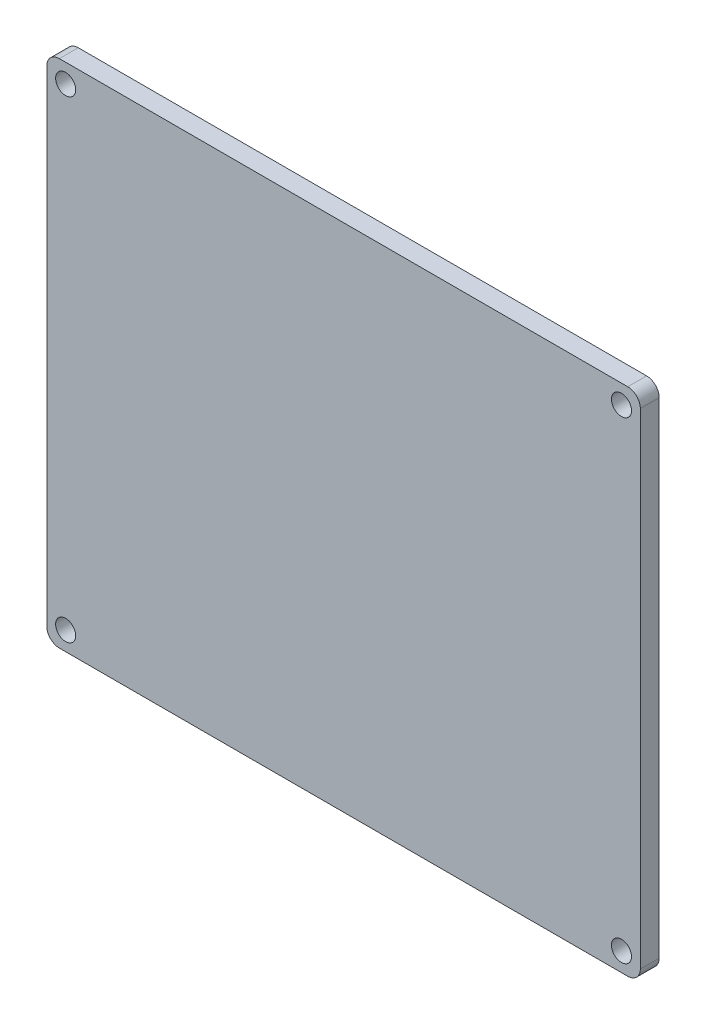
ISO-10303-21;
HEADER;
FILE_DESCRIPTION(('STEP AP214'),'2;1');
FILE_NAME('part.step','',(''),(''),'','','');
FILE_SCHEMA(('AUTOMOTIVE_DESIGN { 1 0 10303 214 1 1 1 1 }'));
ENDSEC;
DATA;
#1=APPLICATION_CONTEXT('core data for automotive mechanical design processes');
#2=APPLICATION_PROTOCOL_DEFINITION('international standard','automotive_design',2000,#1);
#3=PRODUCT_CONTEXT('',#1,'mechanical');
#4=PRODUCT('Part','Part','',(#3));
#5=PRODUCT_RELATED_PRODUCT_CATEGORY('part','',(#4));
#6=PRODUCT_DEFINITION_FORMATION('','',#4);
#7=PRODUCT_DEFINITION_CONTEXT('part definition',#1,'design');
#8=PRODUCT_DEFINITION('design','',#6,#7);
#9=PRODUCT_DEFINITION_SHAPE('','',#8);
#10=(LENGTH_UNIT() NAMED_UNIT(*) SI_UNIT(.MILLI.,.METRE.));
#11=(NAMED_UNIT(*) PLANE_ANGLE_UNIT() SI_UNIT($,.RADIAN.));
#12=(NAMED_UNIT(*) SI_UNIT($,.STERADIAN.) SOLID_ANGLE_UNIT());
#13=UNCERTAINTY_MEASURE_WITH_UNIT(LENGTH_MEASURE(1.E-05),#10,'distance_accuracy_value','');
#14=(GEOMETRIC_REPRESENTATION_CONTEXT(3) GLOBAL_UNCERTAINTY_ASSIGNED_CONTEXT((#13)) GLOBAL_UNIT_ASSIGNED_CONTEXT((#10,
#11,#12)) REPRESENTATION_CONTEXT('',''));
#15=CARTESIAN_POINT('',(0.,0.,0.));
#16=DIRECTION('',(0.,0.,1.));
#17=DIRECTION('',(1.,0.,0.));
#18=AXIS2_PLACEMENT_3D('',#15,#16,#17);
#19=CARTESIAN_POINT('',(47.2,0.,3.));
#20=DIRECTION('',(1.,0.,0.));
#21=DIRECTION('',(0.,1.,0.));
#22=AXIS2_PLACEMENT_3D('',#19,#20,#21);
#23=PLANE('',#22);
#24=DIRECTION('',(0.,-1.,0.));
#25=VECTOR('',#24,1.);
#26=CARTESIAN_POINT('',(47.2,0.,3.));
#27=LINE('',#26,#25);
#28=CARTESIAN_POINT('',(47.2,38.6,3.));
#29=VERTEX_POINT('',#28);
#30=CARTESIAN_POINT('',(47.2,-38.6,3.));
#31=VERTEX_POINT('',#30);
#32=EDGE_CURVE('E164',#29,#31,#27,.T.);
#33=ORIENTED_EDGE('',*,*,#32,.T.);
#34=DIRECTION('',(0.,0.,-1.));
#35=VECTOR('',#34,1.);
#36=CARTESIAN_POINT('',(47.2,-38.6,3.));
#37=LINE('',#36,#35);
#38=CARTESIAN_POINT('',(47.2,-38.6,0.));
#39=VERTEX_POINT('',#38);
#40=EDGE_CURVE('E118',#31,#39,#37,.T.);
#41=ORIENTED_EDGE('',*,*,#40,.T.);
#42=DIRECTION('',(0.,-1.,0.));
#43=VECTOR('',#42,1.);
#44=CARTESIAN_POINT('',(47.2,0.,0.));
#45=LINE('',#44,#43);
#46=CARTESIAN_POINT('',(47.2,38.6,0.));
#47=VERTEX_POINT('',#46);
#48=EDGE_CURVE('E110',#47,#39,#45,.T.);
#49=ORIENTED_EDGE('',*,*,#48,.F.);
#50=DIRECTION('',(0.,0.,-1.));
#51=VECTOR('',#50,1.);
#52=CARTESIAN_POINT('',(47.2,38.6,3.));
#53=LINE('',#52,#51);
#54=EDGE_CURVE('E123',#47,#29,#53,.F.);
#55=ORIENTED_EDGE('',*,*,#54,.T.);
#56=EDGE_LOOP('',(#33,#41,#49,#55));
#57=FACE_BOUND('',#56,.T.);
#58=ADVANCED_FACE('F41',(#57),#23,.T.);
#59=CARTESIAN_POINT('',(0.,40.6,3.));
#60=DIRECTION('',(0.,-1.,0.));
#61=DIRECTION('',(1.,0.,0.));
#62=AXIS2_PLACEMENT_3D('',#59,#60,#61);
#63=PLANE('',#62);
#64=DIRECTION('',(-1.,0.,0.));
#65=VECTOR('',#64,1.);
#66=CARTESIAN_POINT('',(0.,40.6,0.));
#67=LINE('',#66,#65);
#68=CARTESIAN_POINT('',(45.2,40.6,0.));
#69=VERTEX_POINT('',#68);
#70=CARTESIAN_POINT('',(-45.2,40.6,0.));
#71=VERTEX_POINT('',#70);
#72=EDGE_CURVE('E112',#69,#71,#67,.T.);
#73=ORIENTED_EDGE('',*,*,#72,.T.);
#74=DIRECTION('',(0.,0.,-1.));
#75=VECTOR('',#74,1.);
#76=CARTESIAN_POINT('',(-45.2,40.6,3.));
#77=LINE('',#76,#75);
#78=CARTESIAN_POINT('',(-45.2,40.6,3.));
#79=VERTEX_POINT('',#78);
#80=EDGE_CURVE('E11',#71,#79,#77,.F.);
#81=ORIENTED_EDGE('',*,*,#80,.T.);
#82=DIRECTION('',(-1.,0.,0.));
#83=VECTOR('',#82,1.);
#84=CARTESIAN_POINT('',(0.,40.6,3.));
#85=LINE('',#84,#83);
#86=CARTESIAN_POINT('',(45.2,40.6,3.));
#87=VERTEX_POINT('',#86);
#88=EDGE_CURVE('E163',#87,#79,#85,.T.);
#89=ORIENTED_EDGE('',*,*,#88,.F.);
#90=DIRECTION('',(0.,0.,-1.));
#91=VECTOR('',#90,1.);
#92=CARTESIAN_POINT('',(45.2,40.6,0.));
#93=LINE('',#92,#91);
#94=EDGE_CURVE('E49',#87,#69,#93,.T.);
#95=ORIENTED_EDGE('',*,*,#94,.T.);
#96=EDGE_LOOP('',(#73,#81,#89,#95));
#97=FACE_BOUND('',#96,.T.);
#98=ADVANCED_FACE('F161',(#97),#63,.F.);
#99=CARTESIAN_POINT('',(-47.2,0.,3.));
#100=DIRECTION('',(1.,0.,0.));
#101=DIRECTION('',(0.,0.,-1.));
#102=AXIS2_PLACEMENT_3D('',#99,#100,#101);
#103=PLANE('',#102);
#104=DIRECTION('',(0.,-1.,0.));
#105=VECTOR('',#104,1.);
#106=CARTESIAN_POINT('',(-47.2,0.,0.));
#107=LINE('',#106,#105);
#108=CARTESIAN_POINT('',(-47.2,38.6,0.));
#109=VERTEX_POINT('',#108);
#110=CARTESIAN_POINT('',(-47.2,-38.6,0.));
#111=VERTEX_POINT('',#110);
#112=EDGE_CURVE('E182',#109,#111,#107,.T.);
#113=ORIENTED_EDGE('',*,*,#112,.T.);
#114=DIRECTION('',(0.,0.,-1.));
#115=VECTOR('',#114,1.);
#116=CARTESIAN_POINT('',(-47.2,-38.6,3.));
#117=LINE('',#116,#115);
#118=CARTESIAN_POINT('',(-47.2,-38.6,3.));
#119=VERTEX_POINT('',#118);
#120=EDGE_CURVE('E56',#111,#119,#117,.F.);
#121=ORIENTED_EDGE('',*,*,#120,.T.);
#122=DIRECTION('',(0.,-1.,0.));
#123=VECTOR('',#122,1.);
#124=CARTESIAN_POINT('',(-47.2,0.,3.));
#125=LINE('',#124,#123);
#126=CARTESIAN_POINT('',(-47.2,38.6,3.));
#127=VERTEX_POINT('',#126);
#128=EDGE_CURVE('E134',#127,#119,#125,.T.);
#129=ORIENTED_EDGE('',*,*,#128,.F.);
#130=DIRECTION('',(0.,0.,-1.));
#131=VECTOR('',#130,1.);
#132=CARTESIAN_POINT('',(-47.2,38.6,3.));
#133=LINE('',#132,#131);
#134=EDGE_CURVE('E156',#127,#109,#133,.T.);
#135=ORIENTED_EDGE('',*,*,#134,.T.);
#136=EDGE_LOOP('',(#113,#121,#129,#135));
#137=FACE_BOUND('',#136,.T.);
#138=ADVANCED_FACE('F221',(#137),#103,.F.);
#139=CARTESIAN_POINT('',(44.2,37.6,3.));
#140=DIRECTION('',(0.,0.,-1.));
#141=DIRECTION('',(-1.,0.,0.));
#142=AXIS2_PLACEMENT_3D('',#139,#140,#141);
#143=CYLINDRICAL_SURFACE('',#142,1.6);
#144=CARTESIAN_POINT('',(44.2,37.6,3.));
#145=DIRECTION('',(0.,0.,1.));
#146=DIRECTION('',(1.,0.,0.));
#147=AXIS2_PLACEMENT_3D('',#144,#145,#146);
#148=CIRCLE('',#147,1.6);
#149=CARTESIAN_POINT('',(45.8,37.6,3.));
#150=VERTEX_POINT('',#149);
#151=EDGE_CURVE('E167',#150,#150,#148,.T.);
#152=ORIENTED_EDGE('',*,*,#151,.T.);
#153=EDGE_LOOP('',(#152));
#154=FACE_BOUND('',#153,.T.);
#155=CARTESIAN_POINT('',(44.2,37.6,0.));
#156=DIRECTION('',(0.,0.,1.));
#157=DIRECTION('',(1.,0.,0.));
#158=AXIS2_PLACEMENT_3D('',#155,#156,#157);
#159=CIRCLE('',#158,1.6);
#160=CARTESIAN_POINT('',(45.8,37.6,0.));
#161=VERTEX_POINT('',#160);
#162=EDGE_CURVE('E126',#161,#161,#159,.T.);
#163=ORIENTED_EDGE('',*,*,#162,.F.);
#164=EDGE_LOOP('',(#163));
#165=FACE_BOUND('',#164,.T.);
#166=ADVANCED_FACE('F200',(#154,#165),#143,.F.);
#167=CARTESIAN_POINT('',(44.2,-37.6,3.));
#168=DIRECTION('',(0.,0.,-1.));
#169=DIRECTION('',(-1.,0.,0.));
#170=AXIS2_PLACEMENT_3D('',#167,#168,#169);
#171=CYLINDRICAL_SURFACE('',#170,1.6);
#172=CARTESIAN_POINT('',(44.2,-37.6,3.));
#173=DIRECTION('',(0.,0.,1.));
#174=DIRECTION('',(1.,0.,0.));
#175=AXIS2_PLACEMENT_3D('',#172,#173,#174);
#176=CIRCLE('',#175,1.6);
#177=CARTESIAN_POINT('',(45.8,-37.6,3.));
#178=VERTEX_POINT('',#177);
#179=EDGE_CURVE('E193',#178,#178,#176,.T.);
#180=ORIENTED_EDGE('',*,*,#179,.T.);
#181=EDGE_LOOP('',(#180));
#182=FACE_BOUND('',#181,.T.);
#183=CARTESIAN_POINT('',(44.2,-37.6,0.));
#184=DIRECTION('',(0.,0.,1.));
#185=DIRECTION('',(1.,0.,0.));
#186=AXIS2_PLACEMENT_3D('',#183,#184,#185);
#187=CIRCLE('',#186,1.6);
#188=CARTESIAN_POINT('',(45.8,-37.6,0.));
#189=VERTEX_POINT('',#188);
#190=EDGE_CURVE('E177',#189,#189,#187,.T.);
#191=ORIENTED_EDGE('',*,*,#190,.F.);
#192=EDGE_LOOP('',(#191));
#193=FACE_BOUND('',#192,.T.);
#194=ADVANCED_FACE('F229',(#182,#193),#171,.F.);
#195=CARTESIAN_POINT('',(-44.2,37.6,3.));
#196=DIRECTION('',(0.,0.,-1.));
#197=DIRECTION('',(-1.,0.,0.));
#198=AXIS2_PLACEMENT_3D('',#195,#196,#197);
#199=CYLINDRICAL_SURFACE('',#198,1.6);
#200=CARTESIAN_POINT('',(-44.2,37.6,3.));
#201=DIRECTION('',(0.,0.,1.));
#202=DIRECTION('',(1.,0.,0.));
#203=AXIS2_PLACEMENT_3D('',#200,#201,#202);
#204=CIRCLE('',#203,1.6);
#205=CARTESIAN_POINT('',(-42.6,37.6,3.));
#206=VERTEX_POINT('',#205);
#207=EDGE_CURVE('E188',#206,#206,#204,.T.);
#208=ORIENTED_EDGE('',*,*,#207,.T.);
#209=EDGE_LOOP('',(#208));
#210=FACE_BOUND('',#209,.T.);
#211=CARTESIAN_POINT('',(-44.2,37.6,0.));
#212=DIRECTION('',(0.,0.,1.));
#213=DIRECTION('',(1.,0.,0.));
#214=AXIS2_PLACEMENT_3D('',#211,#212,#213);
#215=CIRCLE('',#214,1.6);
#216=CARTESIAN_POINT('',(-42.6,37.6,0.));
#217=VERTEX_POINT('',#216);
#218=EDGE_CURVE('E174',#217,#217,#215,.T.);
#219=ORIENTED_EDGE('',*,*,#218,.F.);
#220=EDGE_LOOP('',(#219));
#221=FACE_BOUND('',#220,.T.);
#222=ADVANCED_FACE('F241',(#210,#221),#199,.F.);
#223=CARTESIAN_POINT('',(-44.2,-37.6,3.));
#224=DIRECTION('',(0.,0.,-1.));
#225=DIRECTION('',(-1.,0.,0.));
#226=AXIS2_PLACEMENT_3D('',#223,#224,#225);
#227=CYLINDRICAL_SURFACE('',#226,1.6);
#228=CARTESIAN_POINT('',(-44.2,-37.6,3.));
#229=DIRECTION('',(0.,0.,1.));
#230=DIRECTION('',(1.,0.,0.));
#231=AXIS2_PLACEMENT_3D('',#228,#229,#230);
#232=CIRCLE('',#231,1.6);
#233=CARTESIAN_POINT('',(-42.6,-37.6,3.));
#234=VERTEX_POINT('',#233);
#235=EDGE_CURVE('E185',#234,#234,#232,.T.);
#236=ORIENTED_EDGE('',*,*,#235,.T.);
#237=EDGE_LOOP('',(#236));
#238=FACE_BOUND('',#237,.T.);
#239=CARTESIAN_POINT('',(-44.2,-37.6,0.));
#240=DIRECTION('',(0.,0.,1.));
#241=DIRECTION('',(1.,0.,0.));
#242=AXIS2_PLACEMENT_3D('',#239,#240,#241);
#243=CIRCLE('',#242,1.6);
#244=CARTESIAN_POINT('',(-42.6,-37.6,0.));
#245=VERTEX_POINT('',#244);
#246=EDGE_CURVE('E171',#245,#245,#243,.T.);
#247=ORIENTED_EDGE('',*,*,#246,.F.);
#248=EDGE_LOOP('',(#247));
#249=FACE_BOUND('',#248,.T.);
#250=ADVANCED_FACE('F245',(#238,#249),#227,.F.);
#251=CARTESIAN_POINT('',(0.,-40.6,3.));
#252=DIRECTION('',(0.,-1.,0.));
#253=DIRECTION('',(1.,0.,0.));
#254=AXIS2_PLACEMENT_3D('',#251,#252,#253);
#255=PLANE('',#254);
#256=DIRECTION('',(-1.,0.,0.));
#257=VECTOR('',#256,1.);
#258=CARTESIAN_POINT('',(0.,-40.6,0.));
#259=LINE('',#258,#257);
#260=CARTESIAN_POINT('',(45.2,-40.6,0.));
#261=VERTEX_POINT('',#260);
#262=CARTESIAN_POINT('',(-45.2,-40.6,0.));
#263=VERTEX_POINT('',#262);
#264=EDGE_CURVE('E137',#261,#263,#259,.T.);
#265=ORIENTED_EDGE('',*,*,#264,.F.);
#266=DIRECTION('',(0.,0.,-1.));
#267=VECTOR('',#266,1.);
#268=CARTESIAN_POINT('',(45.2,-40.6,3.));
#269=LINE('',#268,#267);
#270=CARTESIAN_POINT('',(45.2,-40.6,3.));
#271=VERTEX_POINT('',#270);
#272=EDGE_CURVE('E148',#261,#271,#269,.F.);
#273=ORIENTED_EDGE('',*,*,#272,.T.);
#274=DIRECTION('',(-1.,0.,0.));
#275=VECTOR('',#274,1.);
#276=CARTESIAN_POINT('',(0.,-40.6,3.));
#277=LINE('',#276,#275);
#278=CARTESIAN_POINT('',(-45.2,-40.6,3.));
#279=VERTEX_POINT('',#278);
#280=EDGE_CURVE('E130',#271,#279,#277,.T.);
#281=ORIENTED_EDGE('',*,*,#280,.T.);
#282=DIRECTION('',(0.,0.,-1.));
#283=VECTOR('',#282,1.);
#284=CARTESIAN_POINT('',(-45.2,-40.6,0.));
#285=LINE('',#284,#283);
#286=EDGE_CURVE('E145',#279,#263,#285,.T.);
#287=ORIENTED_EDGE('',*,*,#286,.T.);
#288=EDGE_LOOP('',(#265,#273,#281,#287));
#289=FACE_BOUND('',#288,.T.);
#290=ADVANCED_FACE('F205',(#289),#255,.T.);
#291=CARTESIAN_POINT('',(0.,0.,3.));
#292=DIRECTION('',(0.,0.,1.));
#293=DIRECTION('',(1.,0.,0.));
#294=AXIS2_PLACEMENT_3D('',#291,#292,#293);
#295=PLANE('',#294);
#296=ORIENTED_EDGE('',*,*,#235,.F.);
#297=EDGE_LOOP('',(#296));
#298=FACE_BOUND('',#297,.T.);
#299=ORIENTED_EDGE('',*,*,#207,.F.);
#300=EDGE_LOOP('',(#299));
#301=FACE_BOUND('',#300,.T.);
#302=ORIENTED_EDGE('',*,*,#179,.F.);
#303=EDGE_LOOP('',(#302));
#304=FACE_BOUND('',#303,.T.);
#305=ORIENTED_EDGE('',*,*,#151,.F.);
#306=EDGE_LOOP('',(#305));
#307=FACE_BOUND('',#306,.T.);
#308=ORIENTED_EDGE('',*,*,#280,.F.);
#309=CARTESIAN_POINT('',(45.2,-38.6,3.));
#310=DIRECTION('',(0.,0.,1.));
#311=DIRECTION('',(1.,0.,0.));
#312=AXIS2_PLACEMENT_3D('',#309,#310,#311);
#313=CIRCLE('',#312,2.);
#314=EDGE_CURVE('E154',#271,#31,#313,.T.);
#315=ORIENTED_EDGE('',*,*,#314,.T.);
#316=ORIENTED_EDGE('',*,*,#32,.F.);
#317=CARTESIAN_POINT('',(45.2,38.6,3.));
#318=DIRECTION('',(0.,0.,1.));
#319=DIRECTION('',(1.,0.,0.));
#320=AXIS2_PLACEMENT_3D('',#317,#318,#319);
#321=CIRCLE('',#320,2.);
#322=EDGE_CURVE('E129',#29,#87,#321,.T.);
#323=ORIENTED_EDGE('',*,*,#322,.T.);
#324=ORIENTED_EDGE('',*,*,#88,.T.);
#325=CARTESIAN_POINT('',(-45.2,38.6,3.));
#326=DIRECTION('',(0.,0.,1.));
#327=DIRECTION('',(1.,0.,0.));
#328=AXIS2_PLACEMENT_3D('',#325,#326,#327);
#329=CIRCLE('',#328,2.);
#330=EDGE_CURVE('E63',#79,#127,#329,.T.);
#331=ORIENTED_EDGE('',*,*,#330,.T.);
#332=ORIENTED_EDGE('',*,*,#128,.T.);
#333=CARTESIAN_POINT('',(-45.2,-38.6,3.));
#334=DIRECTION('',(0.,0.,1.));
#335=DIRECTION('',(1.,0.,0.));
#336=AXIS2_PLACEMENT_3D('',#333,#334,#335);
#337=CIRCLE('',#336,2.);
#338=EDGE_CURVE('E152',#119,#279,#337,.T.);
#339=ORIENTED_EDGE('',*,*,#338,.T.);
#340=EDGE_LOOP('',(#308,#315,#316,#323,#324,#331,#332,#339));
#341=FACE_BOUND('',#340,.T.);
#342=ADVANCED_FACE('F203',(#298,#301,#304,#307,#341),#295,.T.);
#343=CARTESIAN_POINT('',(0.,0.,0.));
#344=DIRECTION('',(0.,0.,1.));
#345=DIRECTION('',(1.,0.,0.));
#346=AXIS2_PLACEMENT_3D('',#343,#344,#345);
#347=PLANE('',#346);
#348=ORIENTED_EDGE('',*,*,#246,.T.);
#349=EDGE_LOOP('',(#348));
#350=FACE_BOUND('',#349,.T.);
#351=ORIENTED_EDGE('',*,*,#218,.T.);
#352=EDGE_LOOP('',(#351));
#353=FACE_BOUND('',#352,.T.);
#354=ORIENTED_EDGE('',*,*,#190,.T.);
#355=EDGE_LOOP('',(#354));
#356=FACE_BOUND('',#355,.T.);
#357=ORIENTED_EDGE('',*,*,#162,.T.);
#358=EDGE_LOOP('',(#357));
#359=FACE_BOUND('',#358,.T.);
#360=ORIENTED_EDGE('',*,*,#48,.T.);
#361=CARTESIAN_POINT('',(45.2,-38.6,0.));
#362=DIRECTION('',(0.,0.,1.));
#363=DIRECTION('',(1.,0.,0.));
#364=AXIS2_PLACEMENT_3D('',#361,#362,#363);
#365=CIRCLE('',#364,2.);
#366=EDGE_CURVE('E143',#39,#261,#365,.F.);
#367=ORIENTED_EDGE('',*,*,#366,.T.);
#368=ORIENTED_EDGE('',*,*,#264,.T.);
#369=CARTESIAN_POINT('',(-45.2,-38.6,0.));
#370=DIRECTION('',(0.,0.,1.));
#371=DIRECTION('',(1.,0.,0.));
#372=AXIS2_PLACEMENT_3D('',#369,#370,#371);
#373=CIRCLE('',#372,2.);
#374=EDGE_CURVE('E141',#263,#111,#373,.F.);
#375=ORIENTED_EDGE('',*,*,#374,.T.);
#376=ORIENTED_EDGE('',*,*,#112,.F.);
#377=CARTESIAN_POINT('',(-45.2,38.6,0.));
#378=DIRECTION('',(0.,0.,1.));
#379=DIRECTION('',(1.,0.,0.));
#380=AXIS2_PLACEMENT_3D('',#377,#378,#379);
#381=CIRCLE('',#380,2.);
#382=EDGE_CURVE('E117',#109,#71,#381,.F.);
#383=ORIENTED_EDGE('',*,*,#382,.T.);
#384=ORIENTED_EDGE('',*,*,#72,.F.);
#385=CARTESIAN_POINT('',(45.2,38.6,0.));
#386=DIRECTION('',(0.,0.,1.));
#387=DIRECTION('',(1.,0.,0.));
#388=AXIS2_PLACEMENT_3D('',#385,#386,#387);
#389=CIRCLE('',#388,2.);
#390=EDGE_CURVE('E107',#69,#47,#389,.F.);
#391=ORIENTED_EDGE('',*,*,#390,.T.);
#392=EDGE_LOOP('',(#360,#367,#368,#375,#376,#383,#384,#391));
#393=FACE_BOUND('',#392,.T.);
#394=ADVANCED_FACE('F109',(#350,#353,#356,#359,#393),#347,.F.);
#395=CARTESIAN_POINT('',(45.2,-38.6,3.));
#396=DIRECTION('',(0.,0.,-1.));
#397=DIRECTION('',(-1.,0.,0.));
#398=AXIS2_PLACEMENT_3D('',#395,#396,#397);
#399=CYLINDRICAL_SURFACE('',#398,2.);
#400=ORIENTED_EDGE('',*,*,#314,.F.);
#401=ORIENTED_EDGE('',*,*,#272,.F.);
#402=ORIENTED_EDGE('',*,*,#366,.F.);
#403=ORIENTED_EDGE('',*,*,#40,.F.);
#404=EDGE_LOOP('',(#400,#401,#402,#403));
#405=FACE_BOUND('',#404,.T.);
#406=ADVANCED_FACE('F215',(#405),#399,.T.);
#407=CARTESIAN_POINT('',(-45.2,-38.6,3.));
#408=DIRECTION('',(0.,0.,1.));
#409=DIRECTION('',(1.,0.,0.));
#410=AXIS2_PLACEMENT_3D('',#407,#408,#409);
#411=CYLINDRICAL_SURFACE('',#410,2.);
#412=ORIENTED_EDGE('',*,*,#338,.F.);
#413=ORIENTED_EDGE('',*,*,#120,.F.);
#414=ORIENTED_EDGE('',*,*,#374,.F.);
#415=ORIENTED_EDGE('',*,*,#286,.F.);
#416=EDGE_LOOP('',(#412,#413,#414,#415));
#417=FACE_BOUND('',#416,.T.);
#418=ADVANCED_FACE('F217',(#417),#411,.T.);
#419=CARTESIAN_POINT('',(-45.2,38.6,3.));
#420=DIRECTION('',(0.,0.,-1.));
#421=DIRECTION('',(-1.,0.,0.));
#422=AXIS2_PLACEMENT_3D('',#419,#420,#421);
#423=CYLINDRICAL_SURFACE('',#422,2.);
#424=ORIENTED_EDGE('',*,*,#330,.F.);
#425=ORIENTED_EDGE('',*,*,#80,.F.);
#426=ORIENTED_EDGE('',*,*,#382,.F.);
#427=ORIENTED_EDGE('',*,*,#134,.F.);
#428=EDGE_LOOP('',(#424,#425,#426,#427));
#429=FACE_BOUND('',#428,.T.);
#430=ADVANCED_FACE('F220',(#429),#423,.T.);
#431=CARTESIAN_POINT('',(45.2,38.6,3.));
#432=DIRECTION('',(0.,0.,1.));
#433=DIRECTION('',(1.,0.,0.));
#434=AXIS2_PLACEMENT_3D('',#431,#432,#433);
#435=CYLINDRICAL_SURFACE('',#434,2.);
#436=ORIENTED_EDGE('',*,*,#322,.F.);
#437=ORIENTED_EDGE('',*,*,#54,.F.);
#438=ORIENTED_EDGE('',*,*,#390,.F.);
#439=ORIENTED_EDGE('',*,*,#94,.F.);
#440=EDGE_LOOP('',(#436,#437,#438,#439));
#441=FACE_BOUND('',#440,.T.);
#442=ADVANCED_FACE('F43',(#441),#435,.T.);
#443=CLOSED_SHELL('',(#58,#98,#138,#166,#194,#222,#250,#290,#342,#394,#406,#418,#430,#442));
#444=MANIFOLD_SOLID_BREP('B2',#443);
#445=ADVANCED_BREP_SHAPE_REPRESENTATION('',(#18,#444),#14);
#446=SHAPE_DEFINITION_REPRESENTATION(#9,#445);
ENDSEC;
END-ISO-10303-21;
